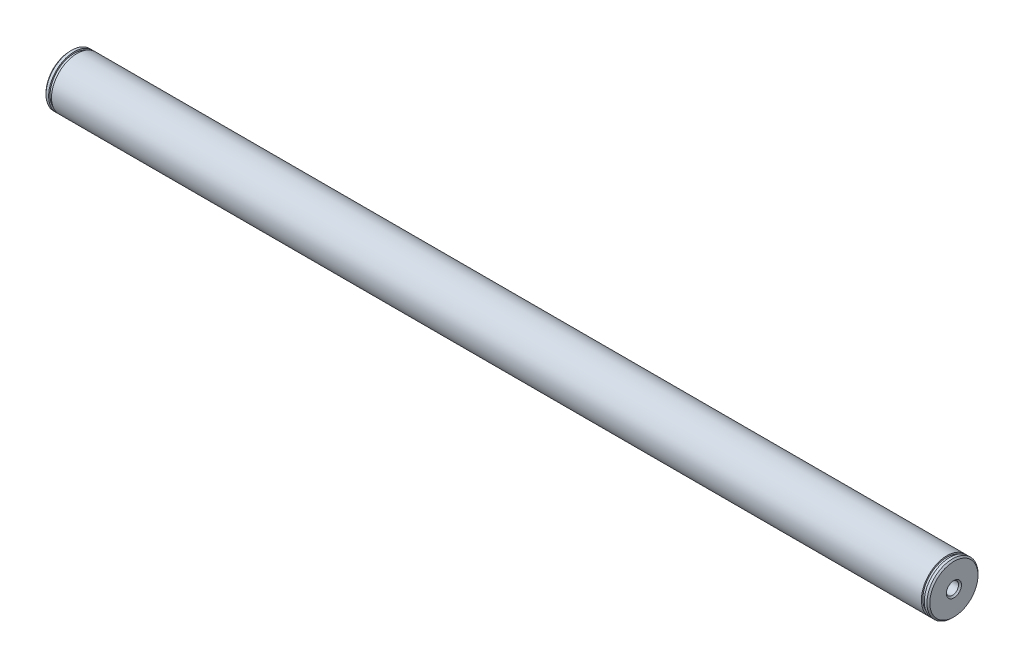
ISO-10303-21;
HEADER;
FILE_DESCRIPTION(('STEP AP214'),'2;1');
FILE_NAME('part.step','',(''),(''),'','','');
FILE_SCHEMA(('AUTOMOTIVE_DESIGN { 1 0 10303 214 1 1 1 1 }'));
ENDSEC;
DATA;
#1=APPLICATION_CONTEXT('core data for automotive mechanical design processes');
#2=APPLICATION_PROTOCOL_DEFINITION('international standard','automotive_design',2000,#1);
#3=PRODUCT_CONTEXT('',#1,'mechanical');
#4=PRODUCT('Part','Part','',(#3));
#5=PRODUCT_RELATED_PRODUCT_CATEGORY('part','',(#4));
#6=PRODUCT_DEFINITION_FORMATION('','',#4);
#7=PRODUCT_DEFINITION_CONTEXT('part definition',#1,'design');
#8=PRODUCT_DEFINITION('design','',#6,#7);
#9=PRODUCT_DEFINITION_SHAPE('','',#8);
#10=(LENGTH_UNIT() NAMED_UNIT(*) SI_UNIT(.MILLI.,.METRE.));
#11=(NAMED_UNIT(*) PLANE_ANGLE_UNIT() SI_UNIT($,.RADIAN.));
#12=(NAMED_UNIT(*) SI_UNIT($,.STERADIAN.) SOLID_ANGLE_UNIT());
#13=UNCERTAINTY_MEASURE_WITH_UNIT(LENGTH_MEASURE(1.E-05),#10,'distance_accuracy_value','');
#14=(GEOMETRIC_REPRESENTATION_CONTEXT(3) GLOBAL_UNCERTAINTY_ASSIGNED_CONTEXT((#13)) GLOBAL_UNIT_ASSIGNED_CONTEXT((#10,
#11,#12)) REPRESENTATION_CONTEXT('',''));
#15=CARTESIAN_POINT('',(0.,0.,0.));
#16=DIRECTION('',(0.,0.,1.));
#17=DIRECTION('',(1.,0.,0.));
#18=AXIS2_PLACEMENT_3D('',#15,#16,#17);
#19=CARTESIAN_POINT('',(193.3575,0.,0.));
#20=DIRECTION('',(-1.,0.,0.));
#21=DIRECTION('',(0.,0.,1.));
#22=AXIS2_PLACEMENT_3D('',#19,#20,#21);
#23=CYLINDRICAL_SURFACE('',#22,11.176);
#24=CARTESIAN_POINT('',(-190.3095,0.,0.));
#25=DIRECTION('',(-1.,0.,0.));
#26=DIRECTION('',(0.,0.,1.));
#27=AXIS2_PLACEMENT_3D('',#24,#25,#26);
#28=CIRCLE('',#27,11.176);
#29=CARTESIAN_POINT('',(-190.3095,0.,11.176));
#30=VERTEX_POINT('',#29);
#31=EDGE_CURVE('E66',#30,#30,#28,.T.);
#32=ORIENTED_EDGE('',*,*,#31,.F.);
#33=EDGE_LOOP('',(#32));
#34=FACE_BOUND('',#33,.T.);
#35=CARTESIAN_POINT('',(190.3095,0.,0.));
#36=DIRECTION('',(1.,0.,0.));
#37=DIRECTION('',(0.,0.,-1.));
#38=AXIS2_PLACEMENT_3D('',#35,#36,#37);
#39=CIRCLE('',#38,11.176);
#40=CARTESIAN_POINT('',(190.3095,0.,-11.176));
#41=VERTEX_POINT('',#40);
#42=EDGE_CURVE('E67',#41,#41,#39,.T.);
#43=ORIENTED_EDGE('',*,*,#42,.F.);
#44=EDGE_LOOP('',(#43));
#45=FACE_BOUND('',#44,.T.);
#46=ADVANCED_FACE('F34',(#34,#45),#23,.T.);
#47=CARTESIAN_POINT('',(-190.3095,0.,0.));
#48=DIRECTION('',(-1.,0.,0.));
#49=DIRECTION('',(0.,0.,1.));
#50=AXIS2_PLACEMENT_3D('',#47,#48,#49);
#51=PLANE('',#50);
#52=CARTESIAN_POINT('',(-190.3095,0.,0.));
#53=DIRECTION('',(-1.,0.,0.));
#54=DIRECTION('',(0.,0.,1.));
#55=AXIS2_PLACEMENT_3D('',#52,#53,#54);
#56=CIRCLE('',#55,10.541);
#57=CARTESIAN_POINT('',(-190.3095,0.,10.541));
#58=VERTEX_POINT('',#57);
#59=EDGE_CURVE('E80',#58,#58,#56,.T.);
#60=ORIENTED_EDGE('',*,*,#59,.F.);
#61=EDGE_LOOP('',(#60));
#62=FACE_BOUND('',#61,.T.);
#63=ORIENTED_EDGE('',*,*,#31,.T.);
#64=EDGE_LOOP('',(#63));
#65=FACE_BOUND('',#64,.T.);
#66=ADVANCED_FACE('F114',(#62,#65),#51,.T.);
#67=CARTESIAN_POINT('',(-191.5795,0.,0.));
#68=DIRECTION('',(-1.,0.,0.));
#69=DIRECTION('',(0.,0.,1.));
#70=AXIS2_PLACEMENT_3D('',#67,#68,#69);
#71=PLANE('',#70);
#72=CARTESIAN_POINT('',(-191.5795,0.,0.));
#73=DIRECTION('',(-1.,0.,0.));
#74=DIRECTION('',(0.,0.,1.));
#75=AXIS2_PLACEMENT_3D('',#72,#73,#74);
#76=CIRCLE('',#75,10.541);
#77=CARTESIAN_POINT('',(-191.5795,0.,10.541));
#78=VERTEX_POINT('',#77);
#79=EDGE_CURVE('E81',#78,#78,#76,.T.);
#80=ORIENTED_EDGE('',*,*,#79,.T.);
#81=EDGE_LOOP('',(#80));
#82=FACE_BOUND('',#81,.T.);
#83=CARTESIAN_POINT('',(-191.5795,0.,0.));
#84=DIRECTION('',(-1.,0.,0.));
#85=DIRECTION('',(0.,0.,1.));
#86=AXIS2_PLACEMENT_3D('',#83,#84,#85);
#87=CIRCLE('',#86,11.176);
#88=CARTESIAN_POINT('',(-191.5795,0.,11.176));
#89=VERTEX_POINT('',#88);
#90=EDGE_CURVE('E77',#89,#89,#87,.T.);
#91=ORIENTED_EDGE('',*,*,#90,.F.);
#92=EDGE_LOOP('',(#91));
#93=FACE_BOUND('',#92,.T.);
#94=ADVANCED_FACE('F121',(#82,#93),#71,.F.);
#95=CARTESIAN_POINT('',(-190.3095,0.,0.));
#96=DIRECTION('',(-1.,0.,0.));
#97=DIRECTION('',(0.,0.,1.));
#98=AXIS2_PLACEMENT_3D('',#95,#96,#97);
#99=CYLINDRICAL_SURFACE('',#98,10.541);
#100=ORIENTED_EDGE('',*,*,#59,.T.);
#101=EDGE_LOOP('',(#100));
#102=FACE_BOUND('',#101,.T.);
#103=ORIENTED_EDGE('',*,*,#79,.F.);
#104=EDGE_LOOP('',(#103));
#105=FACE_BOUND('',#104,.T.);
#106=ADVANCED_FACE('F140',(#102,#105),#99,.T.);
#107=CARTESIAN_POINT('',(-193.3575,0.,0.));
#108=DIRECTION('',(1.,0.,0.));
#109=DIRECTION('',(0.,0.,-1.));
#110=AXIS2_PLACEMENT_3D('',#107,#108,#109);
#111=PLANE('',#110);
#112=CARTESIAN_POINT('',(-193.3575,0.,0.));
#113=DIRECTION('',(1.,0.,0.));
#114=DIRECTION('',(0.,0.,-1.));
#115=AXIS2_PLACEMENT_3D('',#112,#113,#114);
#116=CIRCLE('',#115,10.541);
#117=CARTESIAN_POINT('',(-193.3575,0.,-10.541));
#118=VERTEX_POINT('',#117);
#119=EDGE_CURVE('E41',#118,#118,#116,.F.);
#120=ORIENTED_EDGE('',*,*,#119,.T.);
#121=EDGE_LOOP('',(#120));
#122=FACE_BOUND('',#121,.T.);
#123=CARTESIAN_POINT('',(-193.3575,0.,0.));
#124=DIRECTION('',(1.,0.,0.));
#125=DIRECTION('',(0.,0.,-1.));
#126=AXIS2_PLACEMENT_3D('',#123,#124,#125);
#127=CIRCLE('',#126,3.30200000000003);
#128=CARTESIAN_POINT('',(-193.3575,0.,-3.30200000000003));
#129=VERTEX_POINT('',#128);
#130=EDGE_CURVE('E45',#129,#129,#127,.T.);
#131=ORIENTED_EDGE('',*,*,#130,.T.);
#132=EDGE_LOOP('',(#131));
#133=FACE_BOUND('',#132,.T.);
#134=ADVANCED_FACE('F132',(#122,#133),#111,.F.);
#135=CARTESIAN_POINT('',(-192.7225,0.,0.));
#136=DIRECTION('',(1.,0.,0.));
#137=DIRECTION('',(0.,0.,-1.));
#138=AXIS2_PLACEMENT_3D('',#135,#136,#137);
#139=CIRCLE('',#138,11.176);
#140=CARTESIAN_POINT('',(-192.7225,0.,-11.176));
#141=VERTEX_POINT('',#140);
#142=EDGE_CURVE('E49',#141,#141,#139,.T.);
#143=ORIENTED_EDGE('',*,*,#142,.T.);
#144=EDGE_LOOP('',(#143));
#145=FACE_BOUND('',#144,.T.);
#146=ORIENTED_EDGE('',*,*,#90,.T.);
#147=EDGE_LOOP('',(#146));
#148=FACE_BOUND('',#147,.T.);
#149=ADVANCED_FACE('F117',(#145,#148),#23,.T.);
#150=CARTESIAN_POINT('',(-167.9575,0.,0.));
#151=DIRECTION('',(-1.,0.,0.));
#152=DIRECTION('',(0.,0.,1.));
#153=AXIS2_PLACEMENT_3D('',#150,#151,#152);
#154=CYLINDRICAL_SURFACE('',#153,2.667);
#155=CARTESIAN_POINT('',(-192.7225,0.,0.));
#156=DIRECTION('',(1.,0.,0.));
#157=DIRECTION('',(0.,0.,-1.));
#158=AXIS2_PLACEMENT_3D('',#155,#156,#157);
#159=CIRCLE('',#158,2.667);
#160=CARTESIAN_POINT('',(-192.7225,0.,-2.667));
#161=VERTEX_POINT('',#160);
#162=EDGE_CURVE('E11',#161,#161,#159,.F.);
#163=ORIENTED_EDGE('',*,*,#162,.T.);
#164=EDGE_LOOP('',(#163));
#165=FACE_BOUND('',#164,.T.);
#166=CARTESIAN_POINT('',(-167.9575,0.,0.));
#167=DIRECTION('',(-1.,0.,0.));
#168=DIRECTION('',(0.,0.,1.));
#169=AXIS2_PLACEMENT_3D('',#166,#167,#168);
#170=CIRCLE('',#169,2.667);
#171=CARTESIAN_POINT('',(-167.9575,0.,2.667));
#172=VERTEX_POINT('',#171);
#173=EDGE_CURVE('E70',#172,#172,#170,.T.);
#174=ORIENTED_EDGE('',*,*,#173,.F.);
#175=EDGE_LOOP('',(#174));
#176=FACE_BOUND('',#175,.T.);
#177=ADVANCED_FACE('F131',(#165,#176),#154,.F.);
#178=CARTESIAN_POINT('',(-167.9575,0.,0.));
#179=DIRECTION('',(-1.,0.,0.));
#180=DIRECTION('',(0.,0.,1.));
#181=AXIS2_PLACEMENT_3D('',#178,#179,#180);
#182=PLANE('',#181);
#183=ORIENTED_EDGE('',*,*,#173,.T.);
#184=EDGE_LOOP('',(#183));
#185=FACE_BOUND('',#184,.T.);
#186=ADVANCED_FACE('F138',(#185),#182,.T.);
#187=CARTESIAN_POINT('',(190.3095,0.,0.));
#188=DIRECTION('',(1.,0.,0.));
#189=DIRECTION('',(0.,0.,-1.));
#190=AXIS2_PLACEMENT_3D('',#187,#188,#189);
#191=PLANE('',#190);
#192=CARTESIAN_POINT('',(190.3095,0.,0.));
#193=DIRECTION('',(-1.,0.,0.));
#194=DIRECTION('',(0.,0.,1.));
#195=AXIS2_PLACEMENT_3D('',#192,#193,#194);
#196=CIRCLE('',#195,10.541);
#197=CARTESIAN_POINT('',(190.3095,0.,10.541));
#198=VERTEX_POINT('',#197);
#199=EDGE_CURVE('E74',#198,#198,#196,.T.);
#200=ORIENTED_EDGE('',*,*,#199,.T.);
#201=EDGE_LOOP('',(#200));
#202=FACE_BOUND('',#201,.T.);
#203=ORIENTED_EDGE('',*,*,#42,.T.);
#204=EDGE_LOOP('',(#203));
#205=FACE_BOUND('',#204,.T.);
#206=ADVANCED_FACE('F260',(#202,#205),#191,.T.);
#207=CARTESIAN_POINT('',(191.5795,0.,0.));
#208=DIRECTION('',(1.,0.,0.));
#209=DIRECTION('',(0.,0.,-1.));
#210=AXIS2_PLACEMENT_3D('',#207,#208,#209);
#211=PLANE('',#210);
#212=CARTESIAN_POINT('',(191.5795,0.,0.));
#213=DIRECTION('',(-1.,0.,0.));
#214=DIRECTION('',(0.,0.,1.));
#215=AXIS2_PLACEMENT_3D('',#212,#213,#214);
#216=CIRCLE('',#215,10.541);
#217=CARTESIAN_POINT('',(191.5795,0.,10.541));
#218=VERTEX_POINT('',#217);
#219=EDGE_CURVE('E88',#218,#218,#216,.T.);
#220=ORIENTED_EDGE('',*,*,#219,.F.);
#221=EDGE_LOOP('',(#220));
#222=FACE_BOUND('',#221,.T.);
#223=CARTESIAN_POINT('',(191.5795,0.,0.));
#224=DIRECTION('',(1.,0.,0.));
#225=DIRECTION('',(0.,0.,-1.));
#226=AXIS2_PLACEMENT_3D('',#223,#224,#225);
#227=CIRCLE('',#226,11.176);
#228=CARTESIAN_POINT('',(191.5795,0.,-11.176));
#229=VERTEX_POINT('',#228);
#230=EDGE_CURVE('E71',#229,#229,#227,.T.);
#231=ORIENTED_EDGE('',*,*,#230,.F.);
#232=EDGE_LOOP('',(#231));
#233=FACE_BOUND('',#232,.T.);
#234=ADVANCED_FACE('F160',(#222,#233),#211,.F.);
#235=CARTESIAN_POINT('',(190.3095,0.,0.));
#236=DIRECTION('',(1.,0.,0.));
#237=DIRECTION('',(0.,0.,-1.));
#238=AXIS2_PLACEMENT_3D('',#235,#236,#237);
#239=CYLINDRICAL_SURFACE('',#238,10.541);
#240=ORIENTED_EDGE('',*,*,#199,.F.);
#241=EDGE_LOOP('',(#240));
#242=FACE_BOUND('',#241,.T.);
#243=ORIENTED_EDGE('',*,*,#219,.T.);
#244=EDGE_LOOP('',(#243));
#245=FACE_BOUND('',#244,.T.);
#246=ADVANCED_FACE('F155',(#242,#245),#239,.T.);
#247=CARTESIAN_POINT('',(193.3575,0.,0.));
#248=DIRECTION('',(1.,0.,0.));
#249=DIRECTION('',(0.,0.,-1.));
#250=AXIS2_PLACEMENT_3D('',#247,#248,#249);
#251=PLANE('',#250);
#252=CARTESIAN_POINT('',(193.3575,0.,0.));
#253=DIRECTION('',(1.,0.,0.));
#254=DIRECTION('',(0.,0.,-1.));
#255=AXIS2_PLACEMENT_3D('',#252,#253,#254);
#256=CIRCLE('',#255,10.541);
#257=CARTESIAN_POINT('',(193.3575,0.,-10.541));
#258=VERTEX_POINT('',#257);
#259=EDGE_CURVE('E60',#258,#258,#256,.T.);
#260=ORIENTED_EDGE('',*,*,#259,.T.);
#261=EDGE_LOOP('',(#260));
#262=FACE_BOUND('',#261,.T.);
#263=CARTESIAN_POINT('',(193.3575,0.,0.));
#264=DIRECTION('',(1.,0.,0.));
#265=DIRECTION('',(0.,0.,-1.));
#266=AXIS2_PLACEMENT_3D('',#263,#264,#265);
#267=CIRCLE('',#266,3.30199999999997);
#268=CARTESIAN_POINT('',(193.3575,0.,-3.30199999999997));
#269=VERTEX_POINT('',#268);
#270=EDGE_CURVE('E63',#269,#269,#267,.F.);
#271=ORIENTED_EDGE('',*,*,#270,.T.);
#272=EDGE_LOOP('',(#271));
#273=FACE_BOUND('',#272,.T.);
#274=ADVANCED_FACE('F128',(#262,#273),#251,.T.);
#275=CARTESIAN_POINT('',(192.7225,0.,0.));
#276=DIRECTION('',(1.,0.,0.));
#277=DIRECTION('',(0.,0.,-1.));
#278=AXIS2_PLACEMENT_3D('',#275,#276,#277);
#279=CIRCLE('',#278,11.176);
#280=CARTESIAN_POINT('',(192.7225,0.,-11.176));
#281=VERTEX_POINT('',#280);
#282=EDGE_CURVE('E57',#281,#281,#279,.F.);
#283=ORIENTED_EDGE('',*,*,#282,.T.);
#284=EDGE_LOOP('',(#283));
#285=FACE_BOUND('',#284,.T.);
#286=ORIENTED_EDGE('',*,*,#230,.T.);
#287=EDGE_LOOP('',(#286));
#288=FACE_BOUND('',#287,.T.);
#289=ADVANCED_FACE('F110',(#285,#288),#23,.T.);
#290=CARTESIAN_POINT('',(167.9575,0.,0.));
#291=DIRECTION('',(1.,0.,0.));
#292=DIRECTION('',(0.,0.,-1.));
#293=AXIS2_PLACEMENT_3D('',#290,#291,#292);
#294=CYLINDRICAL_SURFACE('',#293,2.667);
#295=CARTESIAN_POINT('',(192.7225,0.,0.));
#296=DIRECTION('',(1.,0.,0.));
#297=DIRECTION('',(0.,0.,-1.));
#298=AXIS2_PLACEMENT_3D('',#295,#296,#297);
#299=CIRCLE('',#298,2.667);
#300=CARTESIAN_POINT('',(192.7225,0.,-2.667));
#301=VERTEX_POINT('',#300);
#302=EDGE_CURVE('E54',#301,#301,#299,.T.);
#303=ORIENTED_EDGE('',*,*,#302,.T.);
#304=EDGE_LOOP('',(#303));
#305=FACE_BOUND('',#304,.T.);
#306=CARTESIAN_POINT('',(167.9575,0.,0.));
#307=DIRECTION('',(-1.,0.,0.));
#308=DIRECTION('',(0.,0.,1.));
#309=AXIS2_PLACEMENT_3D('',#306,#307,#308);
#310=CIRCLE('',#309,2.667);
#311=CARTESIAN_POINT('',(167.9575,0.,2.667));
#312=VERTEX_POINT('',#311);
#313=EDGE_CURVE('E91',#312,#312,#310,.T.);
#314=ORIENTED_EDGE('',*,*,#313,.T.);
#315=EDGE_LOOP('',(#314));
#316=FACE_BOUND('',#315,.T.);
#317=ADVANCED_FACE('F97',(#305,#316),#294,.F.);
#318=CARTESIAN_POINT('',(167.9575,0.,0.));
#319=DIRECTION('',(1.,0.,0.));
#320=DIRECTION('',(0.,0.,1.));
#321=AXIS2_PLACEMENT_3D('',#318,#319,#320);
#322=PLANE('',#321);
#323=ORIENTED_EDGE('',*,*,#313,.F.);
#324=EDGE_LOOP('',(#323));
#325=FACE_BOUND('',#324,.T.);
#326=ADVANCED_FACE('F99',(#325),#322,.T.);
#327=CARTESIAN_POINT('',(193.3575,0.,0.));
#328=DIRECTION('',(-1.,0.,0.));
#329=DIRECTION('',(0.,0.,1.));
#330=AXIS2_PLACEMENT_3D('',#327,#328,#329);
#331=CONICAL_SURFACE('',#330,10.541,0.785398163397478);
#332=ORIENTED_EDGE('',*,*,#282,.F.);
#333=EDGE_LOOP('',(#332));
#334=FACE_BOUND('',#333,.T.);
#335=ORIENTED_EDGE('',*,*,#259,.F.);
#336=EDGE_LOOP('',(#335));
#337=FACE_BOUND('',#336,.T.);
#338=ADVANCED_FACE('F101',(#334,#337),#331,.T.);
#339=CARTESIAN_POINT('',(193.3575,0.,0.));
#340=DIRECTION('',(1.,0.,0.));
#341=DIRECTION('',(0.,0.,-1.));
#342=AXIS2_PLACEMENT_3D('',#339,#340,#341);
#343=CONICAL_SURFACE('',#342,3.30199999999997,0.785398163397451);
#344=ORIENTED_EDGE('',*,*,#302,.F.);
#345=EDGE_LOOP('',(#344));
#346=FACE_BOUND('',#345,.T.);
#347=ORIENTED_EDGE('',*,*,#270,.F.);
#348=EDGE_LOOP('',(#347));
#349=FACE_BOUND('',#348,.T.);
#350=ADVANCED_FACE('F107',(#346,#349),#343,.F.);
#351=CARTESIAN_POINT('',(-192.7225,0.,0.));
#352=DIRECTION('',(1.,0.,0.));
#353=DIRECTION('',(0.,0.,-1.));
#354=AXIS2_PLACEMENT_3D('',#351,#352,#353);
#355=CONICAL_SURFACE('',#354,11.176,0.785398163397392);
#356=ORIENTED_EDGE('',*,*,#119,.F.);
#357=EDGE_LOOP('',(#356));
#358=FACE_BOUND('',#357,.T.);
#359=ORIENTED_EDGE('',*,*,#142,.F.);
#360=EDGE_LOOP('',(#359));
#361=FACE_BOUND('',#360,.T.);
#362=ADVANCED_FACE('F168',(#358,#361),#355,.T.);
#363=CARTESIAN_POINT('',(-192.7225,0.,0.));
#364=DIRECTION('',(-1.,0.,0.));
#365=DIRECTION('',(0.,0.,1.));
#366=AXIS2_PLACEMENT_3D('',#363,#364,#365);
#367=CONICAL_SURFACE('',#366,2.667,0.785398163397407);
#368=ORIENTED_EDGE('',*,*,#130,.F.);
#369=EDGE_LOOP('',(#368));
#370=FACE_BOUND('',#369,.T.);
#371=ORIENTED_EDGE('',*,*,#162,.F.);
#372=EDGE_LOOP('',(#371));
#373=FACE_BOUND('',#372,.T.);
#374=ADVANCED_FACE('F36',(#370,#373),#367,.F.);
#375=CLOSED_SHELL('',(#46,#66,#94,#106,#134,#149,#177,#186,#206,#234,#246,#274,#289,#317,#326,
#338,#350,#362,#374));
#376=MANIFOLD_SOLID_BREP('B2',#375);
#377=ADVANCED_BREP_SHAPE_REPRESENTATION('',(#18,#376),#14);
#378=SHAPE_DEFINITION_REPRESENTATION(#9,#377);
ENDSEC;
END-ISO-10303-21;
